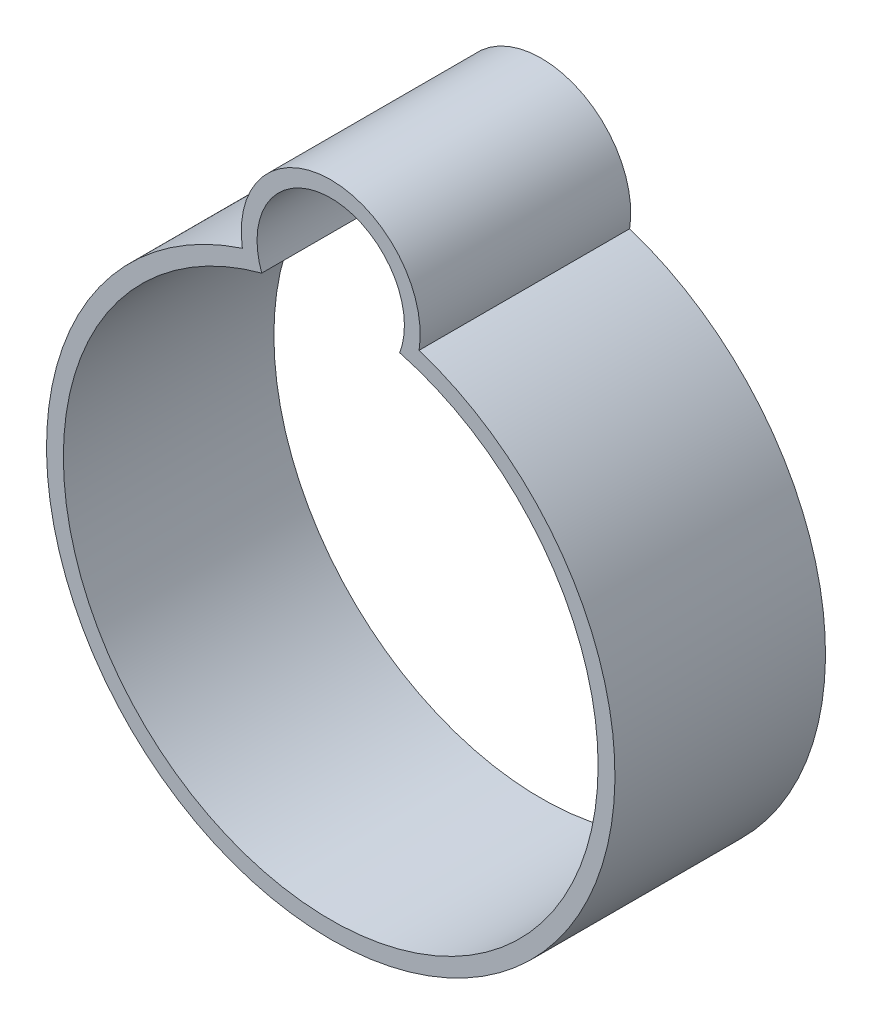
ISO-10303-21;
HEADER;
FILE_DESCRIPTION(('STEP AP214'),'2;1');
FILE_NAME('part.step','',(''),(''),'','','');
FILE_SCHEMA(('AUTOMOTIVE_DESIGN { 1 0 10303 214 1 1 1 1 }'));
ENDSEC;
DATA;
#1=APPLICATION_CONTEXT('core data for automotive mechanical design processes');
#2=APPLICATION_PROTOCOL_DEFINITION('international standard','automotive_design',2000,#1);
#3=PRODUCT_CONTEXT('',#1,'mechanical');
#4=PRODUCT('Part','Part','',(#3));
#5=PRODUCT_RELATED_PRODUCT_CATEGORY('part','',(#4));
#6=PRODUCT_DEFINITION_FORMATION('','',#4);
#7=PRODUCT_DEFINITION_CONTEXT('part definition',#1,'design');
#8=PRODUCT_DEFINITION('design','',#6,#7);
#9=PRODUCT_DEFINITION_SHAPE('','',#8);
#10=(LENGTH_UNIT() NAMED_UNIT(*) SI_UNIT(.MILLI.,.METRE.));
#11=(NAMED_UNIT(*) PLANE_ANGLE_UNIT() SI_UNIT($,.RADIAN.));
#12=(NAMED_UNIT(*) SI_UNIT($,.STERADIAN.) SOLID_ANGLE_UNIT());
#13=UNCERTAINTY_MEASURE_WITH_UNIT(LENGTH_MEASURE(1.E-05),#10,'distance_accuracy_value','');
#14=(GEOMETRIC_REPRESENTATION_CONTEXT(3) GLOBAL_UNCERTAINTY_ASSIGNED_CONTEXT((#13)) GLOBAL_UNIT_ASSIGNED_CONTEXT((#10,
#11,#12)) REPRESENTATION_CONTEXT('',''));
#15=CARTESIAN_POINT('',(0.,0.,0.));
#16=DIRECTION('',(0.,0.,1.));
#17=DIRECTION('',(1.,0.,0.));
#18=AXIS2_PLACEMENT_3D('',#15,#16,#17);
#19=CARTESIAN_POINT('',(0.,6.75,10.));
#20=DIRECTION('',(0.,0.,1.));
#21=DIRECTION('',(1.,0.,0.));
#22=AXIS2_PLACEMENT_3D('',#19,#20,#21);
#23=PLANE('',#22);
#24=CARTESIAN_POINT('',(0.,13.5,10.));
#25=DIRECTION('',(0.,0.,1.));
#26=DIRECTION('',(1.,0.,0.));
#27=AXIS2_PLACEMENT_3D('',#24,#25,#26);
#28=CIRCLE('',#27,4.25);
#29=CARTESIAN_POINT('',(4.19701843901534,12.8310185185185,10.));
#30=VERTEX_POINT('',#29);
#31=CARTESIAN_POINT('',(-4.19701843901534,12.8310185185185,10.));
#32=VERTEX_POINT('',#31);
#33=EDGE_CURVE('E89',#30,#32,#28,.T.);
#34=ORIENTED_EDGE('',*,*,#33,.T.);
#35=CARTESIAN_POINT('',(0.,0.,10.));
#36=DIRECTION('',(0.,0.,1.));
#37=DIRECTION('',(1.,0.,0.));
#38=AXIS2_PLACEMENT_3D('',#35,#36,#37);
#39=CIRCLE('',#38,13.5);
#40=EDGE_CURVE('E92',#32,#30,#39,.T.);
#41=ORIENTED_EDGE('',*,*,#40,.T.);
#42=EDGE_LOOP('',(#34,#41));
#43=FACE_BOUND('',#42,.T.);
#44=CARTESIAN_POINT('',(0.,13.5,10.));
#45=DIRECTION('',(0.,0.,1.));
#46=DIRECTION('',(1.,0.,0.));
#47=AXIS2_PLACEMENT_3D('',#44,#45,#46);
#48=CIRCLE('',#47,3.5);
#49=CARTESIAN_POINT('',(3.27675144006987,12.27,10.));
#50=VERTEX_POINT('',#49);
#51=CARTESIAN_POINT('',(-3.27675144006987,12.27,10.));
#52=VERTEX_POINT('',#51);
#53=EDGE_CURVE('E72',#50,#52,#48,.T.);
#54=ORIENTED_EDGE('',*,*,#53,.F.);
#55=CARTESIAN_POINT('',(0.,0.,10.));
#56=DIRECTION('',(0.,0.,1.));
#57=DIRECTION('',(1.,0.,0.));
#58=AXIS2_PLACEMENT_3D('',#55,#56,#57);
#59=CIRCLE('',#58,12.7);
#60=EDGE_CURVE('E78',#52,#50,#59,.T.);
#61=ORIENTED_EDGE('',*,*,#60,.F.);
#62=EDGE_LOOP('',(#54,#61));
#63=FACE_BOUND('',#62,.T.);
#64=ADVANCED_FACE('F32',(#43,#63),#23,.T.);
#65=CARTESIAN_POINT('',(0.,6.75,0.));
#66=DIRECTION('',(0.,0.,1.));
#67=DIRECTION('',(1.,0.,0.));
#68=AXIS2_PLACEMENT_3D('',#65,#66,#67);
#69=PLANE('',#68);
#70=CARTESIAN_POINT('',(0.,13.5,0.));
#71=DIRECTION('',(0.,0.,1.));
#72=DIRECTION('',(1.,0.,0.));
#73=AXIS2_PLACEMENT_3D('',#70,#71,#72);
#74=CIRCLE('',#73,4.25);
#75=CARTESIAN_POINT('',(4.19701843901534,12.8310185185185,0.));
#76=VERTEX_POINT('',#75);
#77=CARTESIAN_POINT('',(-4.19701843901534,12.8310185185185,0.));
#78=VERTEX_POINT('',#77);
#79=EDGE_CURVE('E88',#76,#78,#74,.T.);
#80=ORIENTED_EDGE('',*,*,#79,.F.);
#81=CARTESIAN_POINT('',(0.,0.,0.));
#82=DIRECTION('',(0.,0.,1.));
#83=DIRECTION('',(1.,0.,0.));
#84=AXIS2_PLACEMENT_3D('',#81,#82,#83);
#85=CIRCLE('',#84,13.5);
#86=EDGE_CURVE('E93',#78,#76,#85,.T.);
#87=ORIENTED_EDGE('',*,*,#86,.F.);
#88=EDGE_LOOP('',(#80,#87));
#89=FACE_BOUND('',#88,.T.);
#90=CARTESIAN_POINT('',(0.,0.,0.));
#91=DIRECTION('',(0.,0.,1.));
#92=DIRECTION('',(1.,0.,0.));
#93=AXIS2_PLACEMENT_3D('',#90,#91,#92);
#94=CIRCLE('',#93,12.7);
#95=CARTESIAN_POINT('',(-3.27675144006987,12.27,0.));
#96=VERTEX_POINT('',#95);
#97=CARTESIAN_POINT('',(3.27675144006987,12.27,0.));
#98=VERTEX_POINT('',#97);
#99=EDGE_CURVE('E54',#96,#98,#94,.T.);
#100=ORIENTED_EDGE('',*,*,#99,.T.);
#101=CARTESIAN_POINT('',(0.,13.5,0.));
#102=DIRECTION('',(0.,0.,1.));
#103=DIRECTION('',(1.,0.,0.));
#104=AXIS2_PLACEMENT_3D('',#101,#102,#103);
#105=CIRCLE('',#104,3.5);
#106=EDGE_CURVE('E82',#98,#96,#105,.T.);
#107=ORIENTED_EDGE('',*,*,#106,.T.);
#108=EDGE_LOOP('',(#100,#107));
#109=FACE_BOUND('',#108,.T.);
#110=ADVANCED_FACE('F105',(#89,#109),#69,.F.);
#111=CARTESIAN_POINT('',(0.,13.5,10.));
#112=DIRECTION('',(0.,0.,-1.));
#113=DIRECTION('',(-1.,0.,0.));
#114=AXIS2_PLACEMENT_3D('',#111,#112,#113);
#115=CYLINDRICAL_SURFACE('',#114,4.25);
#116=ORIENTED_EDGE('',*,*,#79,.T.);
#117=DIRECTION('',(0.,0.,-1.));
#118=VECTOR('',#117,1.);
#119=CARTESIAN_POINT('',(-4.19701843901534,12.8310185185185,10.));
#120=LINE('',#119,#118);
#121=EDGE_CURVE('E11',#32,#78,#120,.T.);
#122=ORIENTED_EDGE('',*,*,#121,.F.);
#123=ORIENTED_EDGE('',*,*,#33,.F.);
#124=DIRECTION('',(0.,0.,-1.));
#125=VECTOR('',#124,1.);
#126=CARTESIAN_POINT('',(4.19701843901534,12.8310185185185,10.));
#127=LINE('',#126,#125);
#128=EDGE_CURVE('E40',#30,#76,#127,.T.);
#129=ORIENTED_EDGE('',*,*,#128,.T.);
#130=EDGE_LOOP('',(#116,#122,#123,#129));
#131=FACE_BOUND('',#130,.T.);
#132=ADVANCED_FACE('F34',(#131),#115,.T.);
#133=CARTESIAN_POINT('',(0.,0.,10.));
#134=DIRECTION('',(0.,0.,-1.));
#135=DIRECTION('',(-1.,0.,0.));
#136=AXIS2_PLACEMENT_3D('',#133,#134,#135);
#137=CYLINDRICAL_SURFACE('',#136,13.5);
#138=ORIENTED_EDGE('',*,*,#86,.T.);
#139=ORIENTED_EDGE('',*,*,#128,.F.);
#140=ORIENTED_EDGE('',*,*,#40,.F.);
#141=ORIENTED_EDGE('',*,*,#121,.T.);
#142=EDGE_LOOP('',(#138,#139,#140,#141));
#143=FACE_BOUND('',#142,.T.);
#144=ADVANCED_FACE('F107',(#143),#137,.T.);
#145=CARTESIAN_POINT('',(0.,0.,10.));
#146=DIRECTION('',(0.,0.,-1.));
#147=DIRECTION('',(-1.,0.,0.));
#148=AXIS2_PLACEMENT_3D('',#145,#146,#147);
#149=CYLINDRICAL_SURFACE('',#148,12.7);
#150=ORIENTED_EDGE('',*,*,#99,.F.);
#151=DIRECTION('',(0.,0.,-1.));
#152=VECTOR('',#151,1.);
#153=CARTESIAN_POINT('',(-3.27675144006987,12.27,10.));
#154=LINE('',#153,#152);
#155=EDGE_CURVE('E74',#52,#96,#154,.T.);
#156=ORIENTED_EDGE('',*,*,#155,.F.);
#157=ORIENTED_EDGE('',*,*,#60,.T.);
#158=DIRECTION('',(0.,0.,-1.));
#159=VECTOR('',#158,1.);
#160=CARTESIAN_POINT('',(3.27675144006987,12.27,10.));
#161=LINE('',#160,#159);
#162=EDGE_CURVE('E47',#50,#98,#161,.T.);
#163=ORIENTED_EDGE('',*,*,#162,.T.);
#164=EDGE_LOOP('',(#150,#156,#157,#163));
#165=FACE_BOUND('',#164,.T.);
#166=ADVANCED_FACE('F80',(#165),#149,.F.);
#167=CARTESIAN_POINT('',(0.,13.5,10.));
#168=DIRECTION('',(0.,0.,-1.));
#169=DIRECTION('',(-1.,0.,0.));
#170=AXIS2_PLACEMENT_3D('',#167,#168,#169);
#171=CYLINDRICAL_SURFACE('',#170,3.5);
#172=ORIENTED_EDGE('',*,*,#106,.F.);
#173=ORIENTED_EDGE('',*,*,#162,.F.);
#174=ORIENTED_EDGE('',*,*,#53,.T.);
#175=ORIENTED_EDGE('',*,*,#155,.T.);
#176=EDGE_LOOP('',(#172,#173,#174,#175));
#177=FACE_BOUND('',#176,.T.);
#178=ADVANCED_FACE('F73',(#177),#171,.F.);
#179=CLOSED_SHELL('',(#64,#110,#132,#144,#166,#178));
#180=MANIFOLD_SOLID_BREP('B2',#179);
#181=ADVANCED_BREP_SHAPE_REPRESENTATION('',(#18,#180),#14);
#182=SHAPE_DEFINITION_REPRESENTATION(#9,#181);
ENDSEC;
END-ISO-10303-21;
